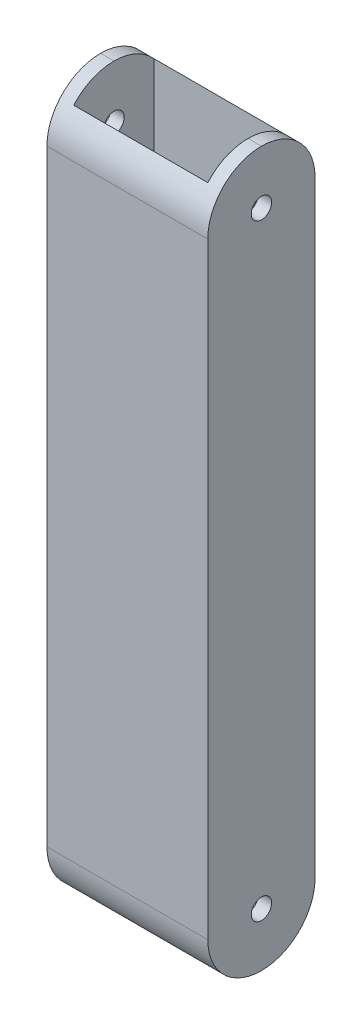
ISO-10303-21;
HEADER;
FILE_DESCRIPTION(('STEP AP214'),'2;1');
FILE_NAME('part.step','',(''),(''),'','','');
FILE_SCHEMA(('AUTOMOTIVE_DESIGN { 1 0 10303 214 1 1 1 1 }'));
ENDSEC;
DATA;
#1=APPLICATION_CONTEXT('core data for automotive mechanical design processes');
#2=APPLICATION_PROTOCOL_DEFINITION('international standard','automotive_design',2000,#1);
#3=PRODUCT_CONTEXT('',#1,'mechanical');
#4=PRODUCT('Part','Part','',(#3));
#5=PRODUCT_RELATED_PRODUCT_CATEGORY('part','',(#4));
#6=PRODUCT_DEFINITION_FORMATION('','',#4);
#7=PRODUCT_DEFINITION_CONTEXT('part definition',#1,'design');
#8=PRODUCT_DEFINITION('design','',#6,#7);
#9=PRODUCT_DEFINITION_SHAPE('','',#8);
#10=(LENGTH_UNIT() NAMED_UNIT(*) SI_UNIT(.MILLI.,.METRE.));
#11=(NAMED_UNIT(*) PLANE_ANGLE_UNIT() SI_UNIT($,.RADIAN.));
#12=(NAMED_UNIT(*) SI_UNIT($,.STERADIAN.) SOLID_ANGLE_UNIT());
#13=UNCERTAINTY_MEASURE_WITH_UNIT(LENGTH_MEASURE(1.E-05),#10,'distance_accuracy_value','');
#14=(GEOMETRIC_REPRESENTATION_CONTEXT(3) GLOBAL_UNCERTAINTY_ASSIGNED_CONTEXT((#13)) GLOBAL_UNIT_ASSIGNED_CONTEXT((#10,
#11,#12)) REPRESENTATION_CONTEXT('',''));
#15=CARTESIAN_POINT('',(0.,0.,0.));
#16=DIRECTION('',(0.,0.,1.));
#17=DIRECTION('',(1.,0.,0.));
#18=AXIS2_PLACEMENT_3D('',#15,#16,#17);
#19=CARTESIAN_POINT('',(19.05,169.106596,12.7));
#20=DIRECTION('',(-1.,0.,0.));
#21=DIRECTION('',(0.,0.,1.));
#22=AXIS2_PLACEMENT_3D('',#19,#20,#21);
#23=PLANE('',#22);
#24=CARTESIAN_POINT('',(19.05,156.406596,0.));
#25=DIRECTION('',(-1.,0.,0.));
#26=DIRECTION('',(0.,0.,1.));
#27=AXIS2_PLACEMENT_3D('',#24,#25,#26);
#28=CIRCLE('',#27,2.41300000000001);
#29=CARTESIAN_POINT('',(19.05,156.406596,-2.41300000000003));
#30=VERTEX_POINT('',#29);
#31=EDGE_CURVE('E255',#30,#30,#28,.T.);
#32=ORIENTED_EDGE('',*,*,#31,.T.);
#33=EDGE_LOOP('',(#32));
#34=FACE_BOUND('',#33,.T.);
#35=CARTESIAN_POINT('',(19.05,12.7,0.));
#36=DIRECTION('',(-1.,0.,0.));
#37=DIRECTION('',(0.,0.,1.));
#38=AXIS2_PLACEMENT_3D('',#35,#36,#37);
#39=CIRCLE('',#38,2.413);
#40=CARTESIAN_POINT('',(19.05,12.7,-2.413));
#41=VERTEX_POINT('',#40);
#42=EDGE_CURVE('E238',#41,#41,#39,.T.);
#43=ORIENTED_EDGE('',*,*,#42,.T.);
#44=EDGE_LOOP('',(#43));
#45=FACE_BOUND('',#44,.T.);
#46=DIRECTION('',(0.,-1.,0.));
#47=VECTOR('',#46,1.);
#48=CARTESIAN_POINT('',(19.05,169.106596,12.7));
#49=LINE('',#48,#47);
#50=CARTESIAN_POINT('',(19.05,156.406596,12.7));
#51=VERTEX_POINT('',#50);
#52=CARTESIAN_POINT('',(19.05,12.7,12.7));
#53=VERTEX_POINT('',#52);
#54=EDGE_CURVE('E212',#51,#53,#49,.T.);
#55=ORIENTED_EDGE('',*,*,#54,.T.);
#56=CARTESIAN_POINT('',(19.05,12.7,0.));
#57=DIRECTION('',(-1.,0.,0.));
#58=DIRECTION('',(0.,0.,1.));
#59=AXIS2_PLACEMENT_3D('',#56,#57,#58);
#60=CIRCLE('',#59,12.7);
#61=CARTESIAN_POINT('',(19.05,0.,0.));
#62=VERTEX_POINT('',#61);
#63=EDGE_CURVE('E56',#53,#62,#60,.F.);
#64=ORIENTED_EDGE('',*,*,#63,.T.);
#65=CARTESIAN_POINT('',(19.05,12.7,0.));
#66=DIRECTION('',(-1.,0.,0.));
#67=DIRECTION('',(0.,0.,1.));
#68=AXIS2_PLACEMENT_3D('',#65,#66,#67);
#69=CIRCLE('',#68,12.7);
#70=CARTESIAN_POINT('',(19.05,12.7,-12.7));
#71=VERTEX_POINT('',#70);
#72=EDGE_CURVE('E148',#62,#71,#69,.F.);
#73=ORIENTED_EDGE('',*,*,#72,.T.);
#74=DIRECTION('',(0.,-1.,0.));
#75=VECTOR('',#74,1.);
#76=CARTESIAN_POINT('',(19.05,169.106596,-12.7));
#77=LINE('',#76,#75);
#78=CARTESIAN_POINT('',(19.05,156.406596,-12.7));
#79=VERTEX_POINT('',#78);
#80=EDGE_CURVE('E225',#79,#71,#77,.T.);
#81=ORIENTED_EDGE('',*,*,#80,.F.);
#82=CARTESIAN_POINT('',(19.05,156.406596,0.));
#83=DIRECTION('',(-1.,0.,0.));
#84=DIRECTION('',(0.,0.,1.));
#85=AXIS2_PLACEMENT_3D('',#82,#83,#84);
#86=CIRCLE('',#85,12.7);
#87=CARTESIAN_POINT('',(19.05,169.106596,0.));
#88=VERTEX_POINT('',#87);
#89=EDGE_CURVE('E182',#79,#88,#86,.F.);
#90=ORIENTED_EDGE('',*,*,#89,.T.);
#91=CARTESIAN_POINT('',(19.05,156.406596,0.));
#92=DIRECTION('',(-1.,0.,0.));
#93=DIRECTION('',(0.,0.,1.));
#94=AXIS2_PLACEMENT_3D('',#91,#92,#93);
#95=CIRCLE('',#94,12.7);
#96=EDGE_CURVE('E64',#88,#51,#95,.F.);
#97=ORIENTED_EDGE('',*,*,#96,.T.);
#98=EDGE_LOOP('',(#55,#64,#73,#81,#90,#97));
#99=FACE_BOUND('',#98,.T.);
#100=ADVANCED_FACE('F39',(#34,#45,#99),#23,.F.);
#101=CARTESIAN_POINT('',(-19.05,169.106596,-12.7));
#102=DIRECTION('',(0.,0.,1.));
#103=DIRECTION('',(1.,0.,0.));
#104=AXIS2_PLACEMENT_3D('',#101,#102,#103);
#105=PLANE('',#104);
#106=DIRECTION('',(0.,-1.,0.));
#107=VECTOR('',#106,1.);
#108=CARTESIAN_POINT('',(-19.05,169.106596,-12.7));
#109=LINE('',#108,#107);
#110=CARTESIAN_POINT('',(-19.05,156.406596,-12.7));
#111=VERTEX_POINT('',#110);
#112=CARTESIAN_POINT('',(-19.05,12.7,-12.7));
#113=VERTEX_POINT('',#112);
#114=EDGE_CURVE('E222',#111,#113,#109,.T.);
#115=ORIENTED_EDGE('',*,*,#114,.F.);
#116=DIRECTION('',(-1.,0.,0.));
#117=VECTOR('',#116,1.);
#118=CARTESIAN_POINT('',(-19.05,156.406596,-12.7));
#119=LINE('',#118,#117);
#120=EDGE_CURVE('E178',#111,#79,#119,.F.);
#121=ORIENTED_EDGE('',*,*,#120,.T.);
#122=ORIENTED_EDGE('',*,*,#80,.T.);
#123=DIRECTION('',(-1.,0.,0.));
#124=VECTOR('',#123,1.);
#125=CARTESIAN_POINT('',(-19.05,12.7,-12.7));
#126=LINE('',#125,#124);
#127=EDGE_CURVE('E176',#71,#113,#126,.T.);
#128=ORIENTED_EDGE('',*,*,#127,.T.);
#129=EDGE_LOOP('',(#115,#121,#122,#128));
#130=FACE_BOUND('',#129,.T.);
#131=ADVANCED_FACE('F290',(#130),#105,.F.);
#132=CARTESIAN_POINT('',(-19.05,169.106596,12.7));
#133=DIRECTION('',(1.,0.,0.));
#134=DIRECTION('',(0.,0.,-1.));
#135=AXIS2_PLACEMENT_3D('',#132,#133,#134);
#136=PLANE('',#135);
#137=CARTESIAN_POINT('',(-19.05,156.406596,0.));
#138=DIRECTION('',(1.,0.,0.));
#139=DIRECTION('',(0.,0.,-1.));
#140=AXIS2_PLACEMENT_3D('',#137,#138,#139);
#141=CIRCLE('',#140,2.41300000000001);
#142=CARTESIAN_POINT('',(-19.05,156.406596,-2.41300000000003));
#143=VERTEX_POINT('',#142);
#144=EDGE_CURVE('E233',#143,#143,#141,.T.);
#145=ORIENTED_EDGE('',*,*,#144,.T.);
#146=EDGE_LOOP('',(#145));
#147=FACE_BOUND('',#146,.T.);
#148=CARTESIAN_POINT('',(-19.05,12.7,0.));
#149=DIRECTION('',(1.,0.,0.));
#150=DIRECTION('',(0.,0.,-1.));
#151=AXIS2_PLACEMENT_3D('',#148,#149,#150);
#152=CIRCLE('',#151,2.413);
#153=CARTESIAN_POINT('',(-19.05,12.7,-2.413));
#154=VERTEX_POINT('',#153);
#155=EDGE_CURVE('E195',#154,#154,#152,.T.);
#156=ORIENTED_EDGE('',*,*,#155,.T.);
#157=EDGE_LOOP('',(#156));
#158=FACE_BOUND('',#157,.T.);
#159=CARTESIAN_POINT('',(-19.05,12.7,0.));
#160=DIRECTION('',(1.,0.,0.));
#161=DIRECTION('',(0.,0.,-1.));
#162=AXIS2_PLACEMENT_3D('',#159,#160,#161);
#163=CIRCLE('',#162,12.7);
#164=CARTESIAN_POINT('',(-19.05,0.,0.));
#165=VERTEX_POINT('',#164);
#166=EDGE_CURVE('E172',#113,#165,#163,.F.);
#167=ORIENTED_EDGE('',*,*,#166,.T.);
#168=CARTESIAN_POINT('',(-19.05,12.7,0.));
#169=DIRECTION('',(1.,0.,0.));
#170=DIRECTION('',(0.,0.,-1.));
#171=AXIS2_PLACEMENT_3D('',#168,#169,#170);
#172=CIRCLE('',#171,12.7);
#173=CARTESIAN_POINT('',(-19.05,12.7,12.7));
#174=VERTEX_POINT('',#173);
#175=EDGE_CURVE('E174',#165,#174,#172,.F.);
#176=ORIENTED_EDGE('',*,*,#175,.T.);
#177=DIRECTION('',(0.,-1.,0.));
#178=VECTOR('',#177,1.);
#179=CARTESIAN_POINT('',(-19.05,169.106596,12.7));
#180=LINE('',#179,#178);
#181=CARTESIAN_POINT('',(-19.05,156.406596,12.7));
#182=VERTEX_POINT('',#181);
#183=EDGE_CURVE('E219',#182,#174,#180,.T.);
#184=ORIENTED_EDGE('',*,*,#183,.F.);
#185=CARTESIAN_POINT('',(-19.05,156.406596,0.));
#186=DIRECTION('',(1.,0.,0.));
#187=DIRECTION('',(0.,0.,-1.));
#188=AXIS2_PLACEMENT_3D('',#185,#186,#187);
#189=CIRCLE('',#188,12.7);
#190=CARTESIAN_POINT('',(-19.05,169.106596,0.));
#191=VERTEX_POINT('',#190);
#192=EDGE_CURVE('E168',#182,#191,#189,.F.);
#193=ORIENTED_EDGE('',*,*,#192,.T.);
#194=CARTESIAN_POINT('',(-19.05,156.406596,0.));
#195=DIRECTION('',(1.,0.,0.));
#196=DIRECTION('',(0.,0.,-1.));
#197=AXIS2_PLACEMENT_3D('',#194,#195,#196);
#198=CIRCLE('',#197,12.7);
#199=EDGE_CURVE('E170',#191,#111,#198,.F.);
#200=ORIENTED_EDGE('',*,*,#199,.T.);
#201=ORIENTED_EDGE('',*,*,#114,.T.);
#202=EDGE_LOOP('',(#167,#176,#184,#193,#200,#201));
#203=FACE_BOUND('',#202,.T.);
#204=ADVANCED_FACE('F270',(#147,#158,#203),#136,.F.);
#205=CARTESIAN_POINT('',(-19.05,169.106596,12.7));
#206=DIRECTION('',(0.,0.,-1.));
#207=DIRECTION('',(-1.,0.,0.));
#208=AXIS2_PLACEMENT_3D('',#205,#206,#207);
#209=PLANE('',#208);
#210=ORIENTED_EDGE('',*,*,#183,.T.);
#211=DIRECTION('',(1.,0.,0.));
#212=VECTOR('',#211,1.);
#213=CARTESIAN_POINT('',(19.05,12.7,12.7));
#214=LINE('',#213,#212);
#215=EDGE_CURVE('E188',#174,#53,#214,.T.);
#216=ORIENTED_EDGE('',*,*,#215,.T.);
#217=ORIENTED_EDGE('',*,*,#54,.F.);
#218=DIRECTION('',(1.,0.,0.));
#219=VECTOR('',#218,1.);
#220=CARTESIAN_POINT('',(-19.05,156.406596,12.7));
#221=LINE('',#220,#219);
#222=EDGE_CURVE('E186',#51,#182,#221,.F.);
#223=ORIENTED_EDGE('',*,*,#222,.T.);
#224=EDGE_LOOP('',(#210,#216,#217,#223));
#225=FACE_BOUND('',#224,.T.);
#226=ADVANCED_FACE('F345',(#225),#209,.F.);
#227=CARTESIAN_POINT('',(15.875,169.106596,9.525));
#228=DIRECTION('',(-1.,0.,0.));
#229=DIRECTION('',(0.,0.,1.));
#230=AXIS2_PLACEMENT_3D('',#227,#228,#229);
#231=PLANE('',#230);
#232=CARTESIAN_POINT('',(15.875,156.406596,0.));
#233=DIRECTION('',(-1.,0.,0.));
#234=DIRECTION('',(0.,0.,1.));
#235=AXIS2_PLACEMENT_3D('',#232,#233,#234);
#236=CIRCLE('',#235,2.41300000000001);
#237=CARTESIAN_POINT('',(15.875,156.406596,-2.41300000000003));
#238=VERTEX_POINT('',#237);
#239=EDGE_CURVE('E237',#238,#238,#236,.T.);
#240=ORIENTED_EDGE('',*,*,#239,.F.);
#241=EDGE_LOOP('',(#240));
#242=FACE_BOUND('',#241,.T.);
#243=CARTESIAN_POINT('',(15.875,12.7,0.));
#244=DIRECTION('',(-1.,0.,0.));
#245=DIRECTION('',(0.,0.,1.));
#246=AXIS2_PLACEMENT_3D('',#243,#244,#245);
#247=CIRCLE('',#246,2.413);
#248=CARTESIAN_POINT('',(15.875,12.7,-2.413));
#249=VERTEX_POINT('',#248);
#250=EDGE_CURVE('E232',#249,#249,#247,.T.);
#251=ORIENTED_EDGE('',*,*,#250,.F.);
#252=EDGE_LOOP('',(#251));
#253=FACE_BOUND('',#252,.T.);
#254=CARTESIAN_POINT('',(15.875,12.7,0.));
#255=DIRECTION('',(-1.,0.,0.));
#256=DIRECTION('',(0.,0.,1.));
#257=AXIS2_PLACEMENT_3D('',#254,#255,#256);
#258=CIRCLE('',#257,12.7);
#259=CARTESIAN_POINT('',(15.875,4.29973958736991,-9.525));
#260=VERTEX_POINT('',#259);
#261=CARTESIAN_POINT('',(15.875,0.,0.));
#262=VERTEX_POINT('',#261);
#263=EDGE_CURVE('E132',#260,#262,#258,.T.);
#264=ORIENTED_EDGE('',*,*,#263,.T.);
#265=CARTESIAN_POINT('',(15.875,12.7,0.));
#266=DIRECTION('',(-1.,0.,0.));
#267=DIRECTION('',(0.,0.,1.));
#268=AXIS2_PLACEMENT_3D('',#265,#266,#267);
#269=CIRCLE('',#268,12.7);
#270=CARTESIAN_POINT('',(15.875,4.29973958736993,9.525));
#271=VERTEX_POINT('',#270);
#272=EDGE_CURVE('E137',#262,#271,#269,.T.);
#273=ORIENTED_EDGE('',*,*,#272,.T.);
#274=DIRECTION('',(0.,-1.,0.));
#275=VECTOR('',#274,1.);
#276=CARTESIAN_POINT('',(15.875,169.106596,9.525));
#277=LINE('',#276,#275);
#278=CARTESIAN_POINT('',(15.875,164.80685641263,9.525));
#279=VERTEX_POINT('',#278);
#280=EDGE_CURVE('E214',#279,#271,#277,.T.);
#281=ORIENTED_EDGE('',*,*,#280,.F.);
#282=CARTESIAN_POINT('',(15.875,156.406596,0.));
#283=DIRECTION('',(-1.,0.,0.));
#284=DIRECTION('',(0.,0.,1.));
#285=AXIS2_PLACEMENT_3D('',#282,#283,#284);
#286=CIRCLE('',#285,12.7);
#287=CARTESIAN_POINT('',(15.875,169.106596,0.));
#288=VERTEX_POINT('',#287);
#289=EDGE_CURVE('E228',#279,#288,#286,.T.);
#290=ORIENTED_EDGE('',*,*,#289,.T.);
#291=CARTESIAN_POINT('',(15.875,156.406596,0.));
#292=DIRECTION('',(-1.,0.,0.));
#293=DIRECTION('',(0.,0.,1.));
#294=AXIS2_PLACEMENT_3D('',#291,#292,#293);
#295=CIRCLE('',#294,12.7);
#296=CARTESIAN_POINT('',(15.875,164.80685641263,-9.525));
#297=VERTEX_POINT('',#296);
#298=EDGE_CURVE('E144',#288,#297,#295,.T.);
#299=ORIENTED_EDGE('',*,*,#298,.T.);
#300=DIRECTION('',(0.,-1.,0.));
#301=VECTOR('',#300,1.);
#302=CARTESIAN_POINT('',(15.875,169.106596,-9.525));
#303=LINE('',#302,#301);
#304=EDGE_CURVE('E141',#297,#260,#303,.T.);
#305=ORIENTED_EDGE('',*,*,#304,.T.);
#306=EDGE_LOOP('',(#264,#273,#281,#290,#299,#305));
#307=FACE_BOUND('',#306,.T.);
#308=ADVANCED_FACE('F134',(#242,#253,#307),#231,.T.);
#309=CARTESIAN_POINT('',(-15.875,169.106596,-9.525));
#310=DIRECTION('',(0.,0.,1.));
#311=DIRECTION('',(1.,0.,0.));
#312=AXIS2_PLACEMENT_3D('',#309,#310,#311);
#313=PLANE('',#312);
#314=ORIENTED_EDGE('',*,*,#304,.F.);
#315=DIRECTION('',(-1.,0.,0.));
#316=VECTOR('',#315,1.);
#317=CARTESIAN_POINT('',(15.875,164.80685641263,-9.525));
#318=LINE('',#317,#316);
#319=CARTESIAN_POINT('',(-15.875,164.80685641263,-9.525));
#320=VERTEX_POINT('',#319);
#321=EDGE_CURVE('E155',#297,#320,#318,.T.);
#322=ORIENTED_EDGE('',*,*,#321,.T.);
#323=DIRECTION('',(0.,-1.,0.));
#324=VECTOR('',#323,1.);
#325=CARTESIAN_POINT('',(-15.875,169.106596,-9.525));
#326=LINE('',#325,#324);
#327=CARTESIAN_POINT('',(-15.875,4.2997395873699,-9.525));
#328=VERTEX_POINT('',#327);
#329=EDGE_CURVE('E206',#320,#328,#326,.T.);
#330=ORIENTED_EDGE('',*,*,#329,.T.);
#331=DIRECTION('',(1.,0.,0.));
#332=VECTOR('',#331,1.);
#333=CARTESIAN_POINT('',(-15.875,4.29973958736991,-9.525));
#334=LINE('',#333,#332);
#335=EDGE_CURVE('E153',#328,#260,#334,.T.);
#336=ORIENTED_EDGE('',*,*,#335,.T.);
#337=EDGE_LOOP('',(#314,#322,#330,#336));
#338=FACE_BOUND('',#337,.T.);
#339=ADVANCED_FACE('F209',(#338),#313,.T.);
#340=CARTESIAN_POINT('',(-15.875,169.106596,9.525));
#341=DIRECTION('',(1.,0.,0.));
#342=DIRECTION('',(0.,0.,-1.));
#343=AXIS2_PLACEMENT_3D('',#340,#341,#342);
#344=PLANE('',#343);
#345=CARTESIAN_POINT('',(-15.875,156.406596,0.));
#346=DIRECTION('',(1.,0.,0.));
#347=DIRECTION('',(0.,0.,-1.));
#348=AXIS2_PLACEMENT_3D('',#345,#346,#347);
#349=CIRCLE('',#348,2.41300000000001);
#350=CARTESIAN_POINT('',(-15.875,156.406596,-2.41300000000003));
#351=VERTEX_POINT('',#350);
#352=EDGE_CURVE('E234',#351,#351,#349,.T.);
#353=ORIENTED_EDGE('',*,*,#352,.F.);
#354=EDGE_LOOP('',(#353));
#355=FACE_BOUND('',#354,.T.);
#356=CARTESIAN_POINT('',(-15.875,12.7,0.));
#357=DIRECTION('',(1.,0.,0.));
#358=DIRECTION('',(0.,0.,-1.));
#359=AXIS2_PLACEMENT_3D('',#356,#357,#358);
#360=CIRCLE('',#359,2.413);
#361=CARTESIAN_POINT('',(-15.875,12.7,-2.413));
#362=VERTEX_POINT('',#361);
#363=EDGE_CURVE('E229',#362,#362,#360,.T.);
#364=ORIENTED_EDGE('',*,*,#363,.F.);
#365=EDGE_LOOP('',(#364));
#366=FACE_BOUND('',#365,.T.);
#367=DIRECTION('',(0.,-1.,0.));
#368=VECTOR('',#367,1.);
#369=CARTESIAN_POINT('',(-15.875,169.106596,9.525));
#370=LINE('',#369,#368);
#371=CARTESIAN_POINT('',(-15.875,164.80685641263,9.525));
#372=VERTEX_POINT('',#371);
#373=CARTESIAN_POINT('',(-15.875,4.29973958736992,9.525));
#374=VERTEX_POINT('',#373);
#375=EDGE_CURVE('E210',#372,#374,#370,.T.);
#376=ORIENTED_EDGE('',*,*,#375,.T.);
#377=CARTESIAN_POINT('',(-15.875,12.7,0.));
#378=DIRECTION('',(1.,0.,0.));
#379=DIRECTION('',(0.,0.,-1.));
#380=AXIS2_PLACEMENT_3D('',#377,#378,#379);
#381=CIRCLE('',#380,12.7);
#382=CARTESIAN_POINT('',(-15.875,0.,0.));
#383=VERTEX_POINT('',#382);
#384=EDGE_CURVE('E166',#374,#383,#381,.T.);
#385=ORIENTED_EDGE('',*,*,#384,.T.);
#386=CARTESIAN_POINT('',(-15.875,12.7,0.));
#387=DIRECTION('',(1.,0.,0.));
#388=DIRECTION('',(0.,0.,-1.));
#389=AXIS2_PLACEMENT_3D('',#386,#387,#388);
#390=CIRCLE('',#389,12.7);
#391=EDGE_CURVE('E164',#383,#328,#390,.T.);
#392=ORIENTED_EDGE('',*,*,#391,.T.);
#393=ORIENTED_EDGE('',*,*,#329,.F.);
#394=CARTESIAN_POINT('',(-15.875,156.406596,0.));
#395=DIRECTION('',(1.,0.,0.));
#396=DIRECTION('',(0.,0.,-1.));
#397=AXIS2_PLACEMENT_3D('',#394,#395,#396);
#398=CIRCLE('',#397,12.7);
#399=CARTESIAN_POINT('',(-15.875,169.106596,0.));
#400=VERTEX_POINT('',#399);
#401=EDGE_CURVE('E162',#320,#400,#398,.T.);
#402=ORIENTED_EDGE('',*,*,#401,.T.);
#403=CARTESIAN_POINT('',(-15.875,156.406596,0.));
#404=DIRECTION('',(1.,0.,0.));
#405=DIRECTION('',(0.,0.,-1.));
#406=AXIS2_PLACEMENT_3D('',#403,#404,#405);
#407=CIRCLE('',#406,12.7);
#408=EDGE_CURVE('E160',#400,#372,#407,.T.);
#409=ORIENTED_EDGE('',*,*,#408,.T.);
#410=EDGE_LOOP('',(#376,#385,#392,#393,#402,#409));
#411=FACE_BOUND('',#410,.T.);
#412=ADVANCED_FACE('F205',(#355,#366,#411),#344,.T.);
#413=CARTESIAN_POINT('',(-15.875,169.106596,9.525));
#414=DIRECTION('',(0.,0.,-1.));
#415=DIRECTION('',(-1.,0.,0.));
#416=AXIS2_PLACEMENT_3D('',#413,#414,#415);
#417=PLANE('',#416);
#418=ORIENTED_EDGE('',*,*,#280,.T.);
#419=DIRECTION('',(-1.,0.,0.));
#420=VECTOR('',#419,1.);
#421=CARTESIAN_POINT('',(15.875,4.29973958736992,9.525));
#422=LINE('',#421,#420);
#423=EDGE_CURVE('E11',#271,#374,#422,.T.);
#424=ORIENTED_EDGE('',*,*,#423,.T.);
#425=ORIENTED_EDGE('',*,*,#375,.F.);
#426=DIRECTION('',(1.,0.,0.));
#427=VECTOR('',#426,1.);
#428=CARTESIAN_POINT('',(-15.875,164.80685641263,9.525));
#429=LINE('',#428,#427);
#430=EDGE_CURVE('E48',#372,#279,#429,.T.);
#431=ORIENTED_EDGE('',*,*,#430,.T.);
#432=EDGE_LOOP('',(#418,#424,#425,#431));
#433=FACE_BOUND('',#432,.T.);
#434=ADVANCED_FACE('F254',(#433),#417,.T.);
#435=CARTESIAN_POINT('',(-19.05,12.7,0.));
#436=DIRECTION('',(1.,0.,0.));
#437=DIRECTION('',(0.,0.,-1.));
#438=AXIS2_PLACEMENT_3D('',#435,#436,#437);
#439=CYLINDRICAL_SURFACE('',#438,2.413);
#440=CARTESIAN_POINT('',(-15.875,12.7,-2.413));
#441=CARTESIAN_POINT('',(-15.9080729166667,12.7,-2.413));
#442=CARTESIAN_POINT('',(-15.9411458333333,12.7,-2.413));
#443=CARTESIAN_POINT('',(-16.0072916666667,12.7,-2.413));
#444=CARTESIAN_POINT('',(-16.0403645833333,12.7,-2.413));
#445=CARTESIAN_POINT('',(-16.1065104166667,12.7,-2.413));
#446=CARTESIAN_POINT('',(-16.1395833333333,12.7,-2.413));
#447=CARTESIAN_POINT('',(-16.2057291666667,12.7,-2.413));
#448=CARTESIAN_POINT('',(-16.2388020833333,12.7,-2.413));
#449=CARTESIAN_POINT('',(-16.3049479166667,12.7,-2.413));
#450=CARTESIAN_POINT('',(-16.3380208333333,12.7,-2.413));
#451=CARTESIAN_POINT('',(-16.4041666666667,12.7,-2.413));
#452=CARTESIAN_POINT('',(-16.4372395833333,12.7,-2.413));
#453=CARTESIAN_POINT('',(-16.5033854166667,12.7,-2.413));
#454=CARTESIAN_POINT('',(-16.5364583333333,12.7,-2.413));
#455=CARTESIAN_POINT('',(-16.6026041666667,12.7,-2.413));
#456=CARTESIAN_POINT('',(-16.6356770833333,12.7,-2.413));
#457=CARTESIAN_POINT('',(-16.7018229166667,12.7,-2.413));
#458=CARTESIAN_POINT('',(-16.7348958333333,12.7,-2.413));
#459=CARTESIAN_POINT('',(-16.8010416666667,12.7,-2.413));
#460=CARTESIAN_POINT('',(-16.8341145833333,12.7,-2.413));
#461=CARTESIAN_POINT('',(-16.9002604166667,12.7,-2.413));
#462=CARTESIAN_POINT('',(-16.9333333333333,12.7,-2.413));
#463=CARTESIAN_POINT('',(-16.9994791666667,12.7,-2.413));
#464=CARTESIAN_POINT('',(-17.0325520833333,12.7,-2.413));
#465=CARTESIAN_POINT('',(-17.0986979166667,12.7,-2.413));
#466=CARTESIAN_POINT('',(-17.1317708333333,12.7,-2.413));
#467=CARTESIAN_POINT('',(-17.1979166666667,12.7,-2.413));
#468=CARTESIAN_POINT('',(-17.2309895833333,12.7,-2.413));
#469=CARTESIAN_POINT('',(-17.2971354166667,12.7,-2.413));
#470=CARTESIAN_POINT('',(-17.3302083333333,12.7,-2.413));
#471=CARTESIAN_POINT('',(-17.3963541666667,12.7,-2.413));
#472=CARTESIAN_POINT('',(-17.4294270833333,12.7,-2.413));
#473=CARTESIAN_POINT('',(-17.4955729166667,12.7,-2.413));
#474=CARTESIAN_POINT('',(-17.5286458333333,12.7,-2.413));
#475=CARTESIAN_POINT('',(-17.5947916666667,12.7,-2.413));
#476=CARTESIAN_POINT('',(-17.6278645833333,12.7,-2.413));
#477=CARTESIAN_POINT('',(-17.6940104166667,12.7,-2.413));
#478=CARTESIAN_POINT('',(-17.7270833333333,12.7,-2.413));
#479=CARTESIAN_POINT('',(-17.7932291666667,12.7,-2.413));
#480=CARTESIAN_POINT('',(-17.8263020833333,12.7,-2.413));
#481=CARTESIAN_POINT('',(-17.8924479166667,12.7,-2.413));
#482=CARTESIAN_POINT('',(-17.9255208333333,12.7,-2.413));
#483=CARTESIAN_POINT('',(-17.9916666666667,12.7,-2.413));
#484=CARTESIAN_POINT('',(-18.0247395833333,12.7,-2.413));
#485=CARTESIAN_POINT('',(-18.0908854166667,12.7,-2.413));
#486=CARTESIAN_POINT('',(-18.1239583333333,12.7,-2.413));
#487=CARTESIAN_POINT('',(-18.1901041666667,12.7,-2.413));
#488=CARTESIAN_POINT('',(-18.2231770833333,12.7,-2.413));
#489=CARTESIAN_POINT('',(-18.2893229166667,12.7,-2.413));
#490=CARTESIAN_POINT('',(-18.3223958333333,12.7,-2.413));
#491=CARTESIAN_POINT('',(-18.3885416666667,12.7,-2.413));
#492=CARTESIAN_POINT('',(-18.4216145833333,12.7,-2.413));
#493=CARTESIAN_POINT('',(-18.4877604166667,12.7,-2.413));
#494=CARTESIAN_POINT('',(-18.5208333333333,12.7,-2.413));
#495=CARTESIAN_POINT('',(-18.5869791666667,12.7,-2.413));
#496=CARTESIAN_POINT('',(-18.6200520833333,12.7,-2.413));
#497=CARTESIAN_POINT('',(-18.6861979166667,12.7,-2.413));
#498=CARTESIAN_POINT('',(-18.7192708333333,12.7,-2.413));
#499=CARTESIAN_POINT('',(-18.7854166666667,12.7,-2.413));
#500=CARTESIAN_POINT('',(-18.8184895833333,12.7,-2.413));
#501=CARTESIAN_POINT('',(-18.8846354166667,12.7,-2.413));
#502=CARTESIAN_POINT('',(-18.9177083333333,12.7,-2.413));
#503=CARTESIAN_POINT('',(-18.9838541666667,12.7,-2.413));
#504=CARTESIAN_POINT('',(-19.0169270833333,12.7,-2.413));
#505=CARTESIAN_POINT('',(-19.05,12.7,-2.413));
#506=B_SPLINE_CURVE_WITH_KNOTS('',3,(#440,#441,#442,#443,#444,#445,#446,#447,#448,#449,#450,
#451,#452,#453,#454,#455,#456,#457,#458,#459,#460,#461,#462,#463,#464,#465,#466,#467,#468,#469,
#470,#471,#472,#473,#474,#475,#476,#477,#478,#479,#480,#481,#482,#483,#484,#485,#486,#487,#488,
#489,#490,#491,#492,#493,#494,#495,#496,#497,#498,#499,#500,#501,#502,#503,#504,#505),
.UNSPECIFIED.,.F.,.F.,(4,2,2,2,2,2,2,2,2,2,2,2,2,2,2,2,2,2,2,2,2,2,2,2,2,2,2,2,2,2,2,2,4),(0.,
0.0992187500000012,0.198437500000002,0.297656250000004,0.396875000000001,0.496093750000003,
0.595312500000004,0.694531250000002,0.793750000000003,0.892968750000004,0.992187500000002,
1.09140625,1.190625,1.28984375,1.3890625,1.48828125,1.5875,1.68671875,1.7859375,1.88515625,
1.984375,2.08359375,2.18281250000001,2.28203125,2.38125,2.48046875000001,2.5796875,
2.67890625000001,2.77812500000001,2.87734375,2.97656250000001,3.07578125000001,3.175),.UNSPECIFIED.);
#507=EDGE_CURVE('BSEAM276',#362,#154,#506,.T.);
#508=ORIENTED_EDGE('',*,*,#363,.T.);
#509=ORIENTED_EDGE('',*,*,#155,.F.);
#510=ORIENTED_EDGE('',*,*,#507,.T.);
#511=ORIENTED_EDGE('',*,*,#507,.F.);
#512=EDGE_LOOP('',(#508,#510,#509,#511));
#513=FACE_BOUND('',#512,.T.);
#514=ADVANCED_FACE('F276',(#513),#439,.F.);
#515=CARTESIAN_POINT('',(-19.05,156.406596,0.));
#516=DIRECTION('',(1.,0.,0.));
#517=DIRECTION('',(0.,0.,-1.));
#518=AXIS2_PLACEMENT_3D('',#515,#516,#517);
#519=CYLINDRICAL_SURFACE('',#518,2.41300000000001);
#520=CARTESIAN_POINT('',(-15.875,156.406596,-2.41300000000003));
#521=CARTESIAN_POINT('',(-15.9080729166667,156.406596,-2.41300000000003));
#522=CARTESIAN_POINT('',(-15.9411458333333,156.406596,-2.41300000000003));
#523=CARTESIAN_POINT('',(-16.0072916666667,156.406596,-2.41300000000003));
#524=CARTESIAN_POINT('',(-16.0403645833333,156.406596,-2.41300000000003));
#525=CARTESIAN_POINT('',(-16.1065104166667,156.406596,-2.41300000000003));
#526=CARTESIAN_POINT('',(-16.1395833333333,156.406596,-2.41300000000003));
#527=CARTESIAN_POINT('',(-16.2057291666667,156.406596,-2.41300000000003));
#528=CARTESIAN_POINT('',(-16.2388020833333,156.406596,-2.41300000000003));
#529=CARTESIAN_POINT('',(-16.3049479166667,156.406596,-2.41300000000003));
#530=CARTESIAN_POINT('',(-16.3380208333333,156.406596,-2.41300000000003));
#531=CARTESIAN_POINT('',(-16.4041666666667,156.406596,-2.41300000000003));
#532=CARTESIAN_POINT('',(-16.4372395833333,156.406596,-2.41300000000003));
#533=CARTESIAN_POINT('',(-16.5033854166667,156.406596,-2.41300000000003));
#534=CARTESIAN_POINT('',(-16.5364583333333,156.406596,-2.41300000000003));
#535=CARTESIAN_POINT('',(-16.6026041666667,156.406596,-2.41300000000003));
#536=CARTESIAN_POINT('',(-16.6356770833333,156.406596,-2.41300000000003));
#537=CARTESIAN_POINT('',(-16.7018229166667,156.406596,-2.41300000000003));
#538=CARTESIAN_POINT('',(-16.7348958333333,156.406596,-2.41300000000003));
#539=CARTESIAN_POINT('',(-16.8010416666667,156.406596,-2.41300000000003));
#540=CARTESIAN_POINT('',(-16.8341145833333,156.406596,-2.41300000000003));
#541=CARTESIAN_POINT('',(-16.9002604166667,156.406596,-2.41300000000003));
#542=CARTESIAN_POINT('',(-16.9333333333333,156.406596,-2.41300000000003));
#543=CARTESIAN_POINT('',(-16.9994791666667,156.406596,-2.41300000000003));
#544=CARTESIAN_POINT('',(-17.0325520833333,156.406596,-2.41300000000003));
#545=CARTESIAN_POINT('',(-17.0986979166667,156.406596,-2.41300000000003));
#546=CARTESIAN_POINT('',(-17.1317708333333,156.406596,-2.41300000000003));
#547=CARTESIAN_POINT('',(-17.1979166666667,156.406596,-2.41300000000003));
#548=CARTESIAN_POINT('',(-17.2309895833333,156.406596,-2.41300000000003));
#549=CARTESIAN_POINT('',(-17.2971354166667,156.406596,-2.41300000000003));
#550=CARTESIAN_POINT('',(-17.3302083333333,156.406596,-2.41300000000003));
#551=CARTESIAN_POINT('',(-17.3963541666667,156.406596,-2.41300000000003));
#552=CARTESIAN_POINT('',(-17.4294270833333,156.406596,-2.41300000000003));
#553=CARTESIAN_POINT('',(-17.4955729166667,156.406596,-2.41300000000003));
#554=CARTESIAN_POINT('',(-17.5286458333333,156.406596,-2.41300000000003));
#555=CARTESIAN_POINT('',(-17.5947916666667,156.406596,-2.41300000000003));
#556=CARTESIAN_POINT('',(-17.6278645833333,156.406596,-2.41300000000003));
#557=CARTESIAN_POINT('',(-17.6940104166667,156.406596,-2.41300000000003));
#558=CARTESIAN_POINT('',(-17.7270833333333,156.406596,-2.41300000000003));
#559=CARTESIAN_POINT('',(-17.7932291666667,156.406596,-2.41300000000003));
#560=CARTESIAN_POINT('',(-17.8263020833333,156.406596,-2.41300000000003));
#561=CARTESIAN_POINT('',(-17.8924479166667,156.406596,-2.41300000000003));
#562=CARTESIAN_POINT('',(-17.9255208333333,156.406596,-2.41300000000003));
#563=CARTESIAN_POINT('',(-17.9916666666667,156.406596,-2.41300000000003));
#564=CARTESIAN_POINT('',(-18.0247395833333,156.406596,-2.41300000000003));
#565=CARTESIAN_POINT('',(-18.0908854166667,156.406596,-2.41300000000003));
#566=CARTESIAN_POINT('',(-18.1239583333333,156.406596,-2.41300000000003));
#567=CARTESIAN_POINT('',(-18.1901041666667,156.406596,-2.41300000000003));
#568=CARTESIAN_POINT('',(-18.2231770833333,156.406596,-2.41300000000003));
#569=CARTESIAN_POINT('',(-18.2893229166667,156.406596,-2.41300000000003));
#570=CARTESIAN_POINT('',(-18.3223958333333,156.406596,-2.41300000000003));
#571=CARTESIAN_POINT('',(-18.3885416666667,156.406596,-2.41300000000003));
#572=CARTESIAN_POINT('',(-18.4216145833333,156.406596,-2.41300000000003));
#573=CARTESIAN_POINT('',(-18.4877604166667,156.406596,-2.41300000000003));
#574=CARTESIAN_POINT('',(-18.5208333333333,156.406596,-2.41300000000003));
#575=CARTESIAN_POINT('',(-18.5869791666667,156.406596,-2.41300000000003));
#576=CARTESIAN_POINT('',(-18.6200520833333,156.406596,-2.41300000000003));
#577=CARTESIAN_POINT('',(-18.6861979166667,156.406596,-2.41300000000003));
#578=CARTESIAN_POINT('',(-18.7192708333333,156.406596,-2.41300000000003));
#579=CARTESIAN_POINT('',(-18.7854166666667,156.406596,-2.41300000000003));
#580=CARTESIAN_POINT('',(-18.8184895833333,156.406596,-2.41300000000003));
#581=CARTESIAN_POINT('',(-18.8846354166667,156.406596,-2.41300000000003));
#582=CARTESIAN_POINT('',(-18.9177083333333,156.406596,-2.41300000000003));
#583=CARTESIAN_POINT('',(-18.9838541666667,156.406596,-2.41300000000003));
#584=CARTESIAN_POINT('',(-19.0169270833333,156.406596,-2.41300000000003));
#585=CARTESIAN_POINT('',(-19.05,156.406596,-2.41300000000003));
#586=B_SPLINE_CURVE_WITH_KNOTS('',3,(#520,#521,#522,#523,#524,#525,#526,#527,#528,#529,#530,
#531,#532,#533,#534,#535,#536,#537,#538,#539,#540,#541,#542,#543,#544,#545,#546,#547,#548,#549,
#550,#551,#552,#553,#554,#555,#556,#557,#558,#559,#560,#561,#562,#563,#564,#565,#566,#567,#568,
#569,#570,#571,#572,#573,#574,#575,#576,#577,#578,#579,#580,#581,#582,#583,#584,#585),
.UNSPECIFIED.,.F.,.F.,(4,2,2,2,2,2,2,2,2,2,2,2,2,2,2,2,2,2,2,2,2,2,2,2,2,2,2,2,2,2,2,2,4),(0.,
0.0992187500000012,0.198437500000002,0.297656250000004,0.396875000000001,0.496093750000003,
0.595312500000004,0.694531250000002,0.793750000000003,0.892968750000004,0.992187500000002,
1.09140625,1.190625,1.28984375,1.3890625,1.48828125,1.5875,1.68671875,1.7859375,1.88515625,
1.984375,2.08359375,2.18281250000001,2.28203125,2.38125,2.48046875000001,2.5796875,
2.67890625000001,2.77812500000001,2.87734375,2.97656250000001,3.07578125000001,3.175),.UNSPECIFIED.);
#587=EDGE_CURVE('BSEAM273',#351,#143,#586,.T.);
#588=ORIENTED_EDGE('',*,*,#352,.T.);
#589=ORIENTED_EDGE('',*,*,#144,.F.);
#590=ORIENTED_EDGE('',*,*,#587,.T.);
#591=ORIENTED_EDGE('',*,*,#587,.F.);
#592=EDGE_LOOP('',(#588,#590,#589,#591));
#593=FACE_BOUND('',#592,.T.);
#594=ADVANCED_FACE('F273',(#593),#519,.F.);
#595=CARTESIAN_POINT('',(15.875,12.7,-2.413));
#596=CARTESIAN_POINT('',(15.9080729166667,12.7,-2.413));
#597=CARTESIAN_POINT('',(15.9411458333333,12.7,-2.413));
#598=CARTESIAN_POINT('',(16.0072916666667,12.7,-2.413));
#599=CARTESIAN_POINT('',(16.0403645833333,12.7,-2.413));
#600=CARTESIAN_POINT('',(16.1065104166667,12.7,-2.413));
#601=CARTESIAN_POINT('',(16.1395833333333,12.7,-2.413));
#602=CARTESIAN_POINT('',(16.2057291666667,12.7,-2.413));
#603=CARTESIAN_POINT('',(16.2388020833333,12.7,-2.413));
#604=CARTESIAN_POINT('',(16.3049479166667,12.7,-2.413));
#605=CARTESIAN_POINT('',(16.3380208333333,12.7,-2.413));
#606=CARTESIAN_POINT('',(16.4041666666667,12.7,-2.413));
#607=CARTESIAN_POINT('',(16.4372395833333,12.7,-2.413));
#608=CARTESIAN_POINT('',(16.5033854166667,12.7,-2.413));
#609=CARTESIAN_POINT('',(16.5364583333333,12.7,-2.413));
#610=CARTESIAN_POINT('',(16.6026041666667,12.7,-2.413));
#611=CARTESIAN_POINT('',(16.6356770833333,12.7,-2.413));
#612=CARTESIAN_POINT('',(16.7018229166667,12.7,-2.413));
#613=CARTESIAN_POINT('',(16.7348958333333,12.7,-2.413));
#614=CARTESIAN_POINT('',(16.8010416666667,12.7,-2.413));
#615=CARTESIAN_POINT('',(16.8341145833333,12.7,-2.413));
#616=CARTESIAN_POINT('',(16.9002604166667,12.7,-2.413));
#617=CARTESIAN_POINT('',(16.9333333333333,12.7,-2.413));
#618=CARTESIAN_POINT('',(16.9994791666667,12.7,-2.413));
#619=CARTESIAN_POINT('',(17.0325520833333,12.7,-2.413));
#620=CARTESIAN_POINT('',(17.0986979166667,12.7,-2.413));
#621=CARTESIAN_POINT('',(17.1317708333333,12.7,-2.413));
#622=CARTESIAN_POINT('',(17.1979166666667,12.7,-2.413));
#623=CARTESIAN_POINT('',(17.2309895833333,12.7,-2.413));
#624=CARTESIAN_POINT('',(17.2971354166667,12.7,-2.413));
#625=CARTESIAN_POINT('',(17.3302083333333,12.7,-2.413));
#626=CARTESIAN_POINT('',(17.3963541666667,12.7,-2.413));
#627=CARTESIAN_POINT('',(17.4294270833333,12.7,-2.413));
#628=CARTESIAN_POINT('',(17.4955729166667,12.7,-2.413));
#629=CARTESIAN_POINT('',(17.5286458333333,12.7,-2.413));
#630=CARTESIAN_POINT('',(17.5947916666667,12.7,-2.413));
#631=CARTESIAN_POINT('',(17.6278645833333,12.7,-2.413));
#632=CARTESIAN_POINT('',(17.6940104166667,12.7,-2.413));
#633=CARTESIAN_POINT('',(17.7270833333333,12.7,-2.413));
#634=CARTESIAN_POINT('',(17.7932291666667,12.7,-2.413));
#635=CARTESIAN_POINT('',(17.8263020833333,12.7,-2.413));
#636=CARTESIAN_POINT('',(17.8924479166667,12.7,-2.413));
#637=CARTESIAN_POINT('',(17.9255208333333,12.7,-2.413));
#638=CARTESIAN_POINT('',(17.9916666666667,12.7,-2.413));
#639=CARTESIAN_POINT('',(18.0247395833333,12.7,-2.413));
#640=CARTESIAN_POINT('',(18.0908854166667,12.7,-2.413));
#641=CARTESIAN_POINT('',(18.1239583333333,12.7,-2.413));
#642=CARTESIAN_POINT('',(18.1901041666667,12.7,-2.413));
#643=CARTESIAN_POINT('',(18.2231770833333,12.7,-2.413));
#644=CARTESIAN_POINT('',(18.2893229166667,12.7,-2.413));
#645=CARTESIAN_POINT('',(18.3223958333333,12.7,-2.413));
#646=CARTESIAN_POINT('',(18.3885416666667,12.7,-2.413));
#647=CARTESIAN_POINT('',(18.4216145833333,12.7,-2.413));
#648=CARTESIAN_POINT('',(18.4877604166667,12.7,-2.413));
#649=CARTESIAN_POINT('',(18.5208333333333,12.7,-2.413));
#650=CARTESIAN_POINT('',(18.5869791666667,12.7,-2.413));
#651=CARTESIAN_POINT('',(18.6200520833333,12.7,-2.413));
#652=CARTESIAN_POINT('',(18.6861979166667,12.7,-2.413));
#653=CARTESIAN_POINT('',(18.7192708333333,12.7,-2.413));
#654=CARTESIAN_POINT('',(18.7854166666667,12.7,-2.413));
#655=CARTESIAN_POINT('',(18.8184895833333,12.7,-2.413));
#656=CARTESIAN_POINT('',(18.8846354166667,12.7,-2.413));
#657=CARTESIAN_POINT('',(18.9177083333333,12.7,-2.413));
#658=CARTESIAN_POINT('',(18.9838541666667,12.7,-2.413));
#659=CARTESIAN_POINT('',(19.0169270833333,12.7,-2.413));
#660=CARTESIAN_POINT('',(19.05,12.7,-2.413));
#661=B_SPLINE_CURVE_WITH_KNOTS('',3,(#595,#596,#597,#598,#599,#600,#601,#602,#603,#604,#605,
#606,#607,#608,#609,#610,#611,#612,#613,#614,#615,#616,#617,#618,#619,#620,#621,#622,#623,#624,
#625,#626,#627,#628,#629,#630,#631,#632,#633,#634,#635,#636,#637,#638,#639,#640,#641,#642,#643,
#644,#645,#646,#647,#648,#649,#650,#651,#652,#653,#654,#655,#656,#657,#658,#659,#660),
.UNSPECIFIED.,.F.,.F.,(4,2,2,2,2,2,2,2,2,2,2,2,2,2,2,2,2,2,2,2,2,2,2,2,2,2,2,2,2,2,2,2,4),(0.,
0.0992187499999977,0.198437500000002,0.29765625,0.396874999999998,0.496093750000003,0.5953125,
0.694531249999998,0.793749999999996,0.892968750000001,0.992187499999998,1.09140625,1.190625,
1.28984375,1.3890625,1.48828125,1.5875,1.68671875,1.7859375,1.88515625,1.984375,2.08359375,
2.1828125,2.28203125,2.38125,2.48046875,2.5796875,2.67890624999999,2.778125,2.87734375,
2.97656249999999,3.07578125,3.175),.UNSPECIFIED.);
#662=EDGE_CURVE('BSEAM275',#249,#41,#661,.T.);
#663=ORIENTED_EDGE('',*,*,#250,.T.);
#664=ORIENTED_EDGE('',*,*,#42,.F.);
#665=ORIENTED_EDGE('',*,*,#662,.T.);
#666=ORIENTED_EDGE('',*,*,#662,.F.);
#667=EDGE_LOOP('',(#663,#665,#664,#666));
#668=FACE_BOUND('',#667,.T.);
#669=ADVANCED_FACE('F275',(#668),#439,.F.);
#670=CARTESIAN_POINT('',(15.875,156.406596,-2.41300000000003));
#671=CARTESIAN_POINT('',(15.9080729166667,156.406596,-2.41300000000003));
#672=CARTESIAN_POINT('',(15.9411458333333,156.406596,-2.41300000000003));
#673=CARTESIAN_POINT('',(16.0072916666667,156.406596,-2.41300000000003));
#674=CARTESIAN_POINT('',(16.0403645833333,156.406596,-2.41300000000003));
#675=CARTESIAN_POINT('',(16.1065104166667,156.406596,-2.41300000000003));
#676=CARTESIAN_POINT('',(16.1395833333333,156.406596,-2.41300000000003));
#677=CARTESIAN_POINT('',(16.2057291666667,156.406596,-2.41300000000003));
#678=CARTESIAN_POINT('',(16.2388020833333,156.406596,-2.41300000000003));
#679=CARTESIAN_POINT('',(16.3049479166667,156.406596,-2.41300000000003));
#680=CARTESIAN_POINT('',(16.3380208333333,156.406596,-2.41300000000003));
#681=CARTESIAN_POINT('',(16.4041666666667,156.406596,-2.41300000000003));
#682=CARTESIAN_POINT('',(16.4372395833333,156.406596,-2.41300000000003));
#683=CARTESIAN_POINT('',(16.5033854166667,156.406596,-2.41300000000003));
#684=CARTESIAN_POINT('',(16.5364583333333,156.406596,-2.41300000000003));
#685=CARTESIAN_POINT('',(16.6026041666667,156.406596,-2.41300000000003));
#686=CARTESIAN_POINT('',(16.6356770833333,156.406596,-2.41300000000003));
#687=CARTESIAN_POINT('',(16.7018229166667,156.406596,-2.41300000000003));
#688=CARTESIAN_POINT('',(16.7348958333333,156.406596,-2.41300000000003));
#689=CARTESIAN_POINT('',(16.8010416666667,156.406596,-2.41300000000003));
#690=CARTESIAN_POINT('',(16.8341145833333,156.406596,-2.41300000000003));
#691=CARTESIAN_POINT('',(16.9002604166667,156.406596,-2.41300000000003));
#692=CARTESIAN_POINT('',(16.9333333333333,156.406596,-2.41300000000003));
#693=CARTESIAN_POINT('',(16.9994791666667,156.406596,-2.41300000000003));
#694=CARTESIAN_POINT('',(17.0325520833333,156.406596,-2.41300000000003));
#695=CARTESIAN_POINT('',(17.0986979166667,156.406596,-2.41300000000003));
#696=CARTESIAN_POINT('',(17.1317708333333,156.406596,-2.41300000000003));
#697=CARTESIAN_POINT('',(17.1979166666667,156.406596,-2.41300000000003));
#698=CARTESIAN_POINT('',(17.2309895833333,156.406596,-2.41300000000003));
#699=CARTESIAN_POINT('',(17.2971354166667,156.406596,-2.41300000000003));
#700=CARTESIAN_POINT('',(17.3302083333333,156.406596,-2.41300000000003));
#701=CARTESIAN_POINT('',(17.3963541666667,156.406596,-2.41300000000003));
#702=CARTESIAN_POINT('',(17.4294270833333,156.406596,-2.41300000000003));
#703=CARTESIAN_POINT('',(17.4955729166667,156.406596,-2.41300000000003));
#704=CARTESIAN_POINT('',(17.5286458333333,156.406596,-2.41300000000003));
#705=CARTESIAN_POINT('',(17.5947916666667,156.406596,-2.41300000000003));
#706=CARTESIAN_POINT('',(17.6278645833333,156.406596,-2.41300000000003));
#707=CARTESIAN_POINT('',(17.6940104166667,156.406596,-2.41300000000003));
#708=CARTESIAN_POINT('',(17.7270833333333,156.406596,-2.41300000000003));
#709=CARTESIAN_POINT('',(17.7932291666667,156.406596,-2.41300000000003));
#710=CARTESIAN_POINT('',(17.8263020833333,156.406596,-2.41300000000003));
#711=CARTESIAN_POINT('',(17.8924479166667,156.406596,-2.41300000000003));
#712=CARTESIAN_POINT('',(17.9255208333333,156.406596,-2.41300000000003));
#713=CARTESIAN_POINT('',(17.9916666666667,156.406596,-2.41300000000003));
#714=CARTESIAN_POINT('',(18.0247395833333,156.406596,-2.41300000000003));
#715=CARTESIAN_POINT('',(18.0908854166667,156.406596,-2.41300000000003));
#716=CARTESIAN_POINT('',(18.1239583333333,156.406596,-2.41300000000003));
#717=CARTESIAN_POINT('',(18.1901041666667,156.406596,-2.41300000000003));
#718=CARTESIAN_POINT('',(18.2231770833333,156.406596,-2.41300000000003));
#719=CARTESIAN_POINT('',(18.2893229166667,156.406596,-2.41300000000003));
#720=CARTESIAN_POINT('',(18.3223958333333,156.406596,-2.41300000000003));
#721=CARTESIAN_POINT('',(18.3885416666667,156.406596,-2.41300000000003));
#722=CARTESIAN_POINT('',(18.4216145833333,156.406596,-2.41300000000003));
#723=CARTESIAN_POINT('',(18.4877604166667,156.406596,-2.41300000000003));
#724=CARTESIAN_POINT('',(18.5208333333333,156.406596,-2.41300000000003));
#725=CARTESIAN_POINT('',(18.5869791666667,156.406596,-2.41300000000003));
#726=CARTESIAN_POINT('',(18.6200520833333,156.406596,-2.41300000000003));
#727=CARTESIAN_POINT('',(18.6861979166667,156.406596,-2.41300000000003));
#728=CARTESIAN_POINT('',(18.7192708333333,156.406596,-2.41300000000003));
#729=CARTESIAN_POINT('',(18.7854166666667,156.406596,-2.41300000000003));
#730=CARTESIAN_POINT('',(18.8184895833333,156.406596,-2.41300000000003));
#731=CARTESIAN_POINT('',(18.8846354166667,156.406596,-2.41300000000003));
#732=CARTESIAN_POINT('',(18.9177083333333,156.406596,-2.41300000000003));
#733=CARTESIAN_POINT('',(18.9838541666667,156.406596,-2.41300000000003));
#734=CARTESIAN_POINT('',(19.0169270833333,156.406596,-2.41300000000003));
#735=CARTESIAN_POINT('',(19.05,156.406596,-2.41300000000003));
#736=B_SPLINE_CURVE_WITH_KNOTS('',3,(#670,#671,#672,#673,#674,#675,#676,#677,#678,#679,#680,
#681,#682,#683,#684,#685,#686,#687,#688,#689,#690,#691,#692,#693,#694,#695,#696,#697,#698,#699,
#700,#701,#702,#703,#704,#705,#706,#707,#708,#709,#710,#711,#712,#713,#714,#715,#716,#717,#718,
#719,#720,#721,#722,#723,#724,#725,#726,#727,#728,#729,#730,#731,#732,#733,#734,#735),
.UNSPECIFIED.,.F.,.F.,(4,2,2,2,2,2,2,2,2,2,2,2,2,2,2,2,2,2,2,2,2,2,2,2,2,2,2,2,2,2,2,2,4),(0.,
0.0992187499999977,0.198437500000002,0.29765625,0.396874999999998,0.496093750000003,0.5953125,
0.694531249999998,0.793749999999996,0.892968750000001,0.992187499999998,1.09140625,1.190625,
1.28984375,1.3890625,1.48828125,1.5875,1.68671875,1.7859375,1.88515625,1.984375,2.08359375,
2.1828125,2.28203125,2.38125,2.48046875,2.5796875,2.67890624999999,2.778125,2.87734375,
2.97656249999999,3.07578125,3.175),.UNSPECIFIED.);
#737=EDGE_CURVE('BSEAM279',#238,#30,#736,.T.);
#738=ORIENTED_EDGE('',*,*,#239,.T.);
#739=ORIENTED_EDGE('',*,*,#31,.F.);
#740=ORIENTED_EDGE('',*,*,#737,.T.);
#741=ORIENTED_EDGE('',*,*,#737,.F.);
#742=EDGE_LOOP('',(#738,#740,#739,#741));
#743=FACE_BOUND('',#742,.T.);
#744=ADVANCED_FACE('F279',(#743),#519,.F.);
#745=CARTESIAN_POINT('',(0.,156.406596,0.));
#746=DIRECTION('',(1.,0.,0.));
#747=DIRECTION('',(0.,0.,-1.));
#748=AXIS2_PLACEMENT_3D('',#745,#746,#747);
#749=CYLINDRICAL_SURFACE('',#748,12.7);
#750=ORIENTED_EDGE('',*,*,#222,.F.);
#751=ORIENTED_EDGE('',*,*,#96,.F.);
#752=DIRECTION('',(1.,0.,0.));
#753=VECTOR('',#752,1.);
#754=CARTESIAN_POINT('',(0.,169.106596,0.));
#755=LINE('',#754,#753);
#756=EDGE_CURVE('E193',#288,#88,#755,.T.);
#757=ORIENTED_EDGE('',*,*,#756,.F.);
#758=ORIENTED_EDGE('',*,*,#289,.F.);
#759=ORIENTED_EDGE('',*,*,#430,.F.);
#760=ORIENTED_EDGE('',*,*,#408,.F.);
#761=DIRECTION('',(1.,0.,0.));
#762=VECTOR('',#761,1.);
#763=CARTESIAN_POINT('',(0.,169.106596,0.));
#764=LINE('',#763,#762);
#765=EDGE_CURVE('E149',#191,#400,#764,.T.);
#766=ORIENTED_EDGE('',*,*,#765,.F.);
#767=ORIENTED_EDGE('',*,*,#192,.F.);
#768=EDGE_LOOP('',(#750,#751,#757,#758,#759,#760,#766,#767));
#769=FACE_BOUND('',#768,.T.);
#770=ADVANCED_FACE('F251',(#769),#749,.T.);
#771=CARTESIAN_POINT('',(0.,156.406596,0.));
#772=DIRECTION('',(-1.,0.,0.));
#773=DIRECTION('',(0.,0.,1.));
#774=AXIS2_PLACEMENT_3D('',#771,#772,#773);
#775=CYLINDRICAL_SURFACE('',#774,12.7);
#776=ORIENTED_EDGE('',*,*,#89,.F.);
#777=ORIENTED_EDGE('',*,*,#120,.F.);
#778=ORIENTED_EDGE('',*,*,#199,.F.);
#779=ORIENTED_EDGE('',*,*,#765,.T.);
#780=ORIENTED_EDGE('',*,*,#401,.F.);
#781=ORIENTED_EDGE('',*,*,#321,.F.);
#782=ORIENTED_EDGE('',*,*,#298,.F.);
#783=ORIENTED_EDGE('',*,*,#756,.T.);
#784=EDGE_LOOP('',(#776,#777,#778,#779,#780,#781,#782,#783));
#785=FACE_BOUND('',#784,.T.);
#786=ADVANCED_FACE('F243',(#785),#775,.T.);
#787=CARTESIAN_POINT('',(-19.05,12.7,0.));
#788=DIRECTION('',(1.,0.,0.));
#789=DIRECTION('',(0.,0.,-1.));
#790=AXIS2_PLACEMENT_3D('',#787,#788,#789);
#791=CYLINDRICAL_SURFACE('',#790,12.7);
#792=DIRECTION('',(-1.,0.,0.));
#793=VECTOR('',#792,1.);
#794=CARTESIAN_POINT('',(19.05,0.,0.));
#795=LINE('',#794,#793);
#796=EDGE_CURVE('E43',#262,#62,#795,.F.);
#797=ORIENTED_EDGE('',*,*,#796,.F.);
#798=ORIENTED_EDGE('',*,*,#263,.F.);
#799=ORIENTED_EDGE('',*,*,#335,.F.);
#800=ORIENTED_EDGE('',*,*,#391,.F.);
#801=DIRECTION('',(-1.,0.,0.));
#802=VECTOR('',#801,1.);
#803=CARTESIAN_POINT('',(19.05,0.,0.));
#804=LINE('',#803,#802);
#805=EDGE_CURVE('E150',#165,#383,#804,.F.);
#806=ORIENTED_EDGE('',*,*,#805,.F.);
#807=ORIENTED_EDGE('',*,*,#166,.F.);
#808=ORIENTED_EDGE('',*,*,#127,.F.);
#809=ORIENTED_EDGE('',*,*,#72,.F.);
#810=EDGE_LOOP('',(#797,#798,#799,#800,#806,#807,#808,#809));
#811=FACE_BOUND('',#810,.T.);
#812=ADVANCED_FACE('F41',(#811),#791,.T.);
#813=CARTESIAN_POINT('',(-19.05,12.7,0.));
#814=DIRECTION('',(-1.,0.,0.));
#815=DIRECTION('',(0.,0.,1.));
#816=AXIS2_PLACEMENT_3D('',#813,#814,#815);
#817=CYLINDRICAL_SURFACE('',#816,12.7);
#818=ORIENTED_EDGE('',*,*,#272,.F.);
#819=ORIENTED_EDGE('',*,*,#796,.T.);
#820=ORIENTED_EDGE('',*,*,#63,.F.);
#821=ORIENTED_EDGE('',*,*,#215,.F.);
#822=ORIENTED_EDGE('',*,*,#175,.F.);
#823=ORIENTED_EDGE('',*,*,#805,.T.);
#824=ORIENTED_EDGE('',*,*,#384,.F.);
#825=ORIENTED_EDGE('',*,*,#423,.F.);
#826=EDGE_LOOP('',(#818,#819,#820,#821,#822,#823,#824,#825));
#827=FACE_BOUND('',#826,.T.);
#828=ADVANCED_FACE('F151',(#827),#817,.T.);
#829=CLOSED_SHELL('',(#100,#131,#204,#226,#308,#339,#412,#434,#514,#594,#669,#744,#770,#786,
#812,#828));
#830=MANIFOLD_SOLID_BREP('B2',#829);
#831=ADVANCED_BREP_SHAPE_REPRESENTATION('',(#18,#830),#14);
#832=SHAPE_DEFINITION_REPRESENTATION(#9,#831);
ENDSEC;
END-ISO-10303-21;
